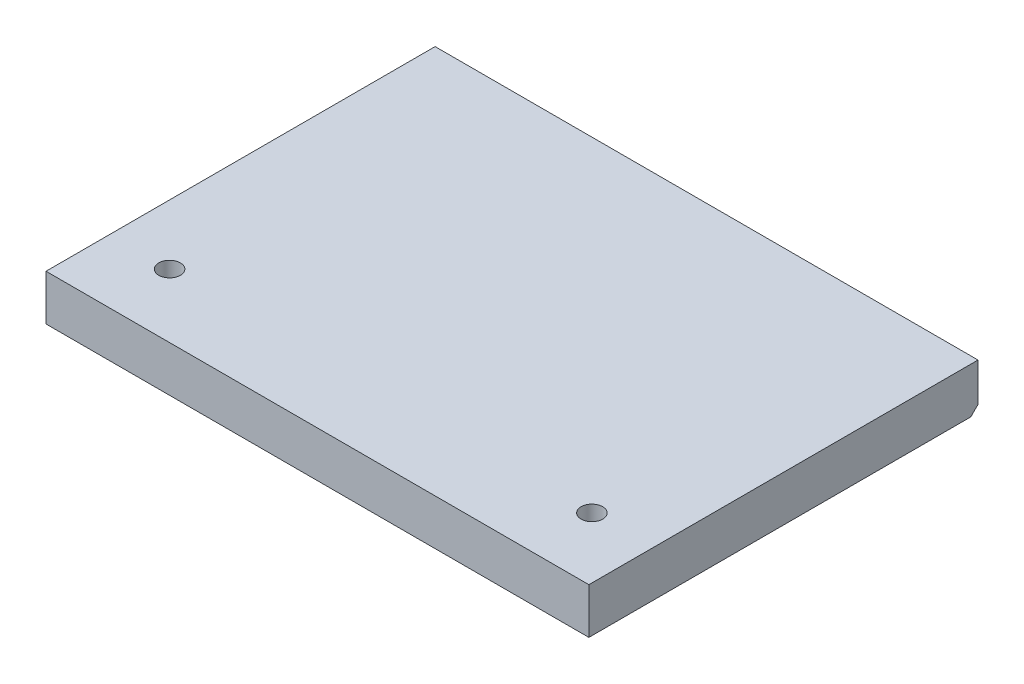
ISO-10303-21;
HEADER;
FILE_DESCRIPTION(('STEP AP214'),'2;1');
FILE_NAME('part.step','',(''),(''),'','','');
FILE_SCHEMA(('AUTOMOTIVE_DESIGN { 1 0 10303 214 1 1 1 1 }'));
ENDSEC;
DATA;
#1=APPLICATION_CONTEXT('core data for automotive mechanical design processes');
#2=APPLICATION_PROTOCOL_DEFINITION('international standard','automotive_design',2000,#1);
#3=PRODUCT_CONTEXT('',#1,'mechanical');
#4=PRODUCT('Part','Part','',(#3));
#5=PRODUCT_RELATED_PRODUCT_CATEGORY('part','',(#4));
#6=PRODUCT_DEFINITION_FORMATION('','',#4);
#7=PRODUCT_DEFINITION_CONTEXT('part definition',#1,'design');
#8=PRODUCT_DEFINITION('design','',#6,#7);
#9=PRODUCT_DEFINITION_SHAPE('','',#8);
#10=(LENGTH_UNIT() NAMED_UNIT(*) SI_UNIT(.MILLI.,.METRE.));
#11=(NAMED_UNIT(*) PLANE_ANGLE_UNIT() SI_UNIT($,.RADIAN.));
#12=(NAMED_UNIT(*) SI_UNIT($,.STERADIAN.) SOLID_ANGLE_UNIT());
#13=UNCERTAINTY_MEASURE_WITH_UNIT(LENGTH_MEASURE(1.E-05),#10,'distance_accuracy_value','');
#14=(GEOMETRIC_REPRESENTATION_CONTEXT(3) GLOBAL_UNCERTAINTY_ASSIGNED_CONTEXT((#13)) GLOBAL_UNIT_ASSIGNED_CONTEXT((#10,
#11,#12)) REPRESENTATION_CONTEXT('',''));
#15=CARTESIAN_POINT('',(0.,0.,0.));
#16=DIRECTION('',(0.,0.,1.));
#17=DIRECTION('',(1.,0.,0.));
#18=AXIS2_PLACEMENT_3D('',#15,#16,#17);
#19=CARTESIAN_POINT('',(0.,6.35,192.4));
#20=DIRECTION('',(0.,1.,0.));
#21=DIRECTION('',(0.,0.,-1.));
#22=AXIS2_PLACEMENT_3D('',#19,#20,#21);
#23=PLANE('',#22);
#24=CARTESIAN_POINT('',(23.46,6.35,141.44));
#25=DIRECTION('',(0.,-1.,0.));
#26=DIRECTION('',(0.,0.,-1.));
#27=AXIS2_PLACEMENT_3D('',#24,#25,#26);
#28=CIRCLE('',#27,1.5);
#29=CARTESIAN_POINT('',(23.46,6.35,139.94));
#30=VERTEX_POINT('',#29);
#31=EDGE_CURVE('E146',#30,#30,#28,.T.);
#32=ORIENTED_EDGE('',*,*,#31,.T.);
#33=EDGE_LOOP('',(#32));
#34=FACE_BOUND('',#33,.T.);
#35=CARTESIAN_POINT('',(-35.24,6.35,141.44));
#36=DIRECTION('',(0.,-1.,0.));
#37=DIRECTION('',(0.,0.,-1.));
#38=AXIS2_PLACEMENT_3D('',#35,#36,#37);
#39=CIRCLE('',#38,1.5);
#40=CARTESIAN_POINT('',(-35.24,6.35,139.94));
#41=VERTEX_POINT('',#40);
#42=EDGE_CURVE('E142',#41,#41,#39,.T.);
#43=ORIENTED_EDGE('',*,*,#42,.T.);
#44=EDGE_LOOP('',(#43));
#45=FACE_BOUND('',#44,.T.);
#46=DIRECTION('',(1.,0.,0.));
#47=VECTOR('',#46,1.);
#48=CARTESIAN_POINT('',(-86.2,6.35,96.2));
#49=LINE('',#48,#47);
#50=CARTESIAN_POINT('',(-43.5724429833944,6.35,96.2));
#51=VERTEX_POINT('',#50);
#52=CARTESIAN_POINT('',(31.8882124627076,6.35,96.2));
#53=VERTEX_POINT('',#52);
#54=EDGE_CURVE('E157',#51,#53,#49,.T.);
#55=ORIENTED_EDGE('',*,*,#54,.F.);
#56=DIRECTION('',(0.,0.,1.));
#57=VECTOR('',#56,1.);
#58=CARTESIAN_POINT('',(-43.5724429833944,6.35,192.4));
#59=LINE('',#58,#57);
#60=CARTESIAN_POINT('',(-43.5724429833944,6.35,150.288085831692));
#61=VERTEX_POINT('',#60);
#62=EDGE_CURVE('E71',#51,#61,#59,.T.);
#63=ORIENTED_EDGE('',*,*,#62,.T.);
#64=DIRECTION('',(1.,0.,0.));
#65=VECTOR('',#64,1.);
#66=CARTESIAN_POINT('',(0.,6.35,150.288085831692));
#67=LINE('',#66,#65);
#68=CARTESIAN_POINT('',(31.8882124627076,6.35,150.288085831692));
#69=VERTEX_POINT('',#68);
#70=EDGE_CURVE('E110',#61,#69,#67,.T.);
#71=ORIENTED_EDGE('',*,*,#70,.T.);
#72=DIRECTION('',(0.,0.,-1.));
#73=VECTOR('',#72,1.);
#74=CARTESIAN_POINT('',(31.8882124627076,6.35,192.4));
#75=LINE('',#74,#73);
#76=EDGE_CURVE('E125',#69,#53,#75,.T.);
#77=ORIENTED_EDGE('',*,*,#76,.T.);
#78=EDGE_LOOP('',(#55,#63,#71,#77));
#79=FACE_BOUND('',#78,.T.);
#80=ADVANCED_FACE('F47',(#34,#45,#79),#23,.T.);
#81=CARTESIAN_POINT('',(-86.2,6.35,96.2));
#82=DIRECTION('',(0.,0.,1.));
#83=DIRECTION('',(-1.,0.,0.));
#84=AXIS2_PLACEMENT_3D('',#81,#82,#83);
#85=PLANE('',#84);
#86=DIRECTION('',(0.,-1.,0.));
#87=VECTOR('',#86,1.);
#88=CARTESIAN_POINT('',(-43.5724429833944,6.35,96.2));
#89=LINE('',#88,#87);
#90=CARTESIAN_POINT('',(-43.5724429833944,1.,96.2));
#91=VERTEX_POINT('',#90);
#92=EDGE_CURVE('E129',#51,#91,#89,.T.);
#93=ORIENTED_EDGE('',*,*,#92,.F.);
#94=ORIENTED_EDGE('',*,*,#54,.T.);
#95=DIRECTION('',(0.,1.,0.));
#96=VECTOR('',#95,1.);
#97=CARTESIAN_POINT('',(31.8882124627076,6.35,96.2));
#98=LINE('',#97,#96);
#99=CARTESIAN_POINT('',(31.8882124627076,1.,96.2));
#100=VERTEX_POINT('',#99);
#101=EDGE_CURVE('E121',#100,#53,#98,.T.);
#102=ORIENTED_EDGE('',*,*,#101,.F.);
#103=DIRECTION('',(1.,0.,0.));
#104=VECTOR('',#103,1.);
#105=CARTESIAN_POINT('',(-86.2,1.,96.2));
#106=LINE('',#105,#104);
#107=EDGE_CURVE('E175',#91,#100,#106,.T.);
#108=ORIENTED_EDGE('',*,*,#107,.F.);
#109=EDGE_LOOP('',(#93,#94,#102,#108));
#110=FACE_BOUND('',#109,.T.);
#111=ADVANCED_FACE('F184',(#110),#85,.F.);
#112=CARTESIAN_POINT('',(0.,0.,192.4));
#113=DIRECTION('',(0.,1.,0.));
#114=DIRECTION('',(0.,0.,-1.));
#115=AXIS2_PLACEMENT_3D('',#112,#113,#114);
#116=PLANE('',#115);
#117=CARTESIAN_POINT('',(-35.24,0.,141.44));
#118=DIRECTION('',(0.,-1.,0.));
#119=DIRECTION('',(0.,0.,-1.));
#120=AXIS2_PLACEMENT_3D('',#117,#118,#119);
#121=CIRCLE('',#120,1.35);
#122=CARTESIAN_POINT('',(-35.24,0.,140.09));
#123=VERTEX_POINT('',#122);
#124=EDGE_CURVE('E158',#123,#123,#121,.F.);
#125=ORIENTED_EDGE('',*,*,#124,.T.);
#126=EDGE_LOOP('',(#125));
#127=FACE_BOUND('',#126,.T.);
#128=CARTESIAN_POINT('',(23.46,0.,141.44));
#129=DIRECTION('',(0.,-1.,0.));
#130=DIRECTION('',(0.,0.,-1.));
#131=AXIS2_PLACEMENT_3D('',#128,#129,#130);
#132=CIRCLE('',#131,1.35);
#133=CARTESIAN_POINT('',(23.46,0.,140.09));
#134=VERTEX_POINT('',#133);
#135=EDGE_CURVE('E153',#134,#134,#132,.F.);
#136=ORIENTED_EDGE('',*,*,#135,.T.);
#137=EDGE_LOOP('',(#136));
#138=FACE_BOUND('',#137,.T.);
#139=DIRECTION('',(0.,0.,1.));
#140=VECTOR('',#139,1.);
#141=CARTESIAN_POINT('',(-43.5724429833944,0.,84.5642891528287));
#142=LINE('',#141,#140);
#143=CARTESIAN_POINT('',(-43.5724429833944,0.,97.2));
#144=VERTEX_POINT('',#143);
#145=CARTESIAN_POINT('',(-43.5724429833944,0.,150.288085831692));
#146=VERTEX_POINT('',#145);
#147=EDGE_CURVE('E94',#144,#146,#142,.T.);
#148=ORIENTED_EDGE('',*,*,#147,.F.);
#149=DIRECTION('',(-1.,0.,0.));
#150=VECTOR('',#149,1.);
#151=CARTESIAN_POINT('',(0.,0.,97.2));
#152=LINE('',#151,#150);
#153=CARTESIAN_POINT('',(31.8882124627076,0.,97.2));
#154=VERTEX_POINT('',#153);
#155=EDGE_CURVE('E166',#154,#144,#152,.T.);
#156=ORIENTED_EDGE('',*,*,#155,.F.);
#157=DIRECTION('',(0.,0.,-1.));
#158=VECTOR('',#157,1.);
#159=CARTESIAN_POINT('',(31.8882124627076,0.,84.5642891528287));
#160=LINE('',#159,#158);
#161=CARTESIAN_POINT('',(31.8882124627076,0.,150.288085831692));
#162=VERTEX_POINT('',#161);
#163=EDGE_CURVE('E63',#162,#154,#160,.T.);
#164=ORIENTED_EDGE('',*,*,#163,.F.);
#165=DIRECTION('',(1.,0.,0.));
#166=VECTOR('',#165,1.);
#167=CARTESIAN_POINT('',(-43.5724429833944,0.,150.288085831692));
#168=LINE('',#167,#166);
#169=EDGE_CURVE('E103',#146,#162,#168,.T.);
#170=ORIENTED_EDGE('',*,*,#169,.F.);
#171=EDGE_LOOP('',(#148,#156,#164,#170));
#172=FACE_BOUND('',#171,.T.);
#173=ADVANCED_FACE('F114',(#127,#138,#172),#116,.F.);
#174=CARTESIAN_POINT('',(-86.2,1.,96.2));
#175=DIRECTION('',(0.,0.707106781186547,0.707106781186547));
#176=DIRECTION('',(1.,0.,0.));
#177=AXIS2_PLACEMENT_3D('',#174,#175,#176);
#178=PLANE('',#177);
#179=ORIENTED_EDGE('',*,*,#155,.T.);
#180=DIRECTION('',(0.,-0.707106781186548,0.707106781186548));
#181=VECTOR('',#180,1.);
#182=CARTESIAN_POINT('',(-43.5724429833944,1.,96.2));
#183=LINE('',#182,#181);
#184=EDGE_CURVE('E11',#144,#91,#183,.F.);
#185=ORIENTED_EDGE('',*,*,#184,.T.);
#186=ORIENTED_EDGE('',*,*,#107,.T.);
#187=DIRECTION('',(0.,0.707106781186548,-0.707106781186548));
#188=VECTOR('',#187,1.);
#189=CARTESIAN_POINT('',(31.8882124627076,1.,96.2));
#190=LINE('',#189,#188);
#191=EDGE_CURVE('E56',#100,#154,#190,.F.);
#192=ORIENTED_EDGE('',*,*,#191,.T.);
#193=EDGE_LOOP('',(#179,#185,#186,#192));
#194=FACE_BOUND('',#193,.T.);
#195=ADVANCED_FACE('F49',(#194),#178,.F.);
#196=CARTESIAN_POINT('',(-35.24,-0.00100000000000013,141.44));
#197=DIRECTION('',(0.,1.,0.));
#198=DIRECTION('',(0.,0.,-1.));
#199=AXIS2_PLACEMENT_3D('',#196,#197,#198);
#200=CYLINDRICAL_SURFACE('',#199,1.35);
#201=ORIENTED_EDGE('',*,*,#124,.F.);
#202=EDGE_LOOP('',(#201));
#203=FACE_BOUND('',#202,.T.);
#204=CARTESIAN_POINT('',(-35.24,1.35,141.44));
#205=DIRECTION('',(0.,-1.,0.));
#206=DIRECTION('',(0.,0.,-1.));
#207=AXIS2_PLACEMENT_3D('',#204,#205,#206);
#208=CIRCLE('',#207,1.35);
#209=CARTESIAN_POINT('',(-35.24,1.35,140.09));
#210=VERTEX_POINT('',#209);
#211=EDGE_CURVE('E162',#210,#210,#208,.F.);
#212=ORIENTED_EDGE('',*,*,#211,.T.);
#213=EDGE_LOOP('',(#212));
#214=FACE_BOUND('',#213,.T.);
#215=ADVANCED_FACE('F197',(#203,#214),#200,.F.);
#216=CARTESIAN_POINT('',(23.46,-0.00100000000000013,141.44));
#217=DIRECTION('',(0.,1.,0.));
#218=DIRECTION('',(0.,0.,-1.));
#219=AXIS2_PLACEMENT_3D('',#216,#217,#218);
#220=CYLINDRICAL_SURFACE('',#219,1.35);
#221=ORIENTED_EDGE('',*,*,#135,.F.);
#222=EDGE_LOOP('',(#221));
#223=FACE_BOUND('',#222,.T.);
#224=CARTESIAN_POINT('',(23.46,1.35,141.44));
#225=DIRECTION('',(0.,-1.,0.));
#226=DIRECTION('',(0.,0.,-1.));
#227=AXIS2_PLACEMENT_3D('',#224,#225,#226);
#228=CIRCLE('',#227,1.35);
#229=CARTESIAN_POINT('',(23.46,1.35,140.09));
#230=VERTEX_POINT('',#229);
#231=EDGE_CURVE('E141',#230,#230,#228,.F.);
#232=ORIENTED_EDGE('',*,*,#231,.T.);
#233=EDGE_LOOP('',(#232));
#234=FACE_BOUND('',#233,.T.);
#235=ADVANCED_FACE('F208',(#223,#234),#220,.F.);
#236=CARTESIAN_POINT('',(23.46,1.35,141.44));
#237=DIRECTION('',(0.,1.,0.));
#238=DIRECTION('',(0.,0.,-1.));
#239=AXIS2_PLACEMENT_3D('',#236,#237,#238);
#240=PLANE('',#239);
#241=CARTESIAN_POINT('',(23.46,1.35,141.44));
#242=DIRECTION('',(0.,-1.,0.));
#243=DIRECTION('',(0.,0.,-1.));
#244=AXIS2_PLACEMENT_3D('',#241,#242,#243);
#245=CIRCLE('',#244,1.5);
#246=CARTESIAN_POINT('',(23.46,1.35,139.94));
#247=VERTEX_POINT('',#246);
#248=EDGE_CURVE('E136',#247,#247,#245,.T.);
#249=ORIENTED_EDGE('',*,*,#248,.F.);
#250=EDGE_LOOP('',(#249));
#251=FACE_BOUND('',#250,.T.);
#252=ORIENTED_EDGE('',*,*,#231,.F.);
#253=EDGE_LOOP('',(#252));
#254=FACE_BOUND('',#253,.T.);
#255=ADVANCED_FACE('F211',(#251,#254),#240,.T.);
#256=CARTESIAN_POINT('',(23.46,1.35,141.44));
#257=DIRECTION('',(0.,1.,0.));
#258=DIRECTION('',(0.,0.,-1.));
#259=AXIS2_PLACEMENT_3D('',#256,#257,#258);
#260=CYLINDRICAL_SURFACE('',#259,1.5);
#261=ORIENTED_EDGE('',*,*,#248,.T.);
#262=EDGE_LOOP('',(#261));
#263=FACE_BOUND('',#262,.T.);
#264=ORIENTED_EDGE('',*,*,#31,.F.);
#265=EDGE_LOOP('',(#264));
#266=FACE_BOUND('',#265,.T.);
#267=ADVANCED_FACE('F215',(#263,#266),#260,.F.);
#268=CARTESIAN_POINT('',(-35.24,1.35,141.44));
#269=DIRECTION('',(0.,1.,0.));
#270=DIRECTION('',(0.,0.,-1.));
#271=AXIS2_PLACEMENT_3D('',#268,#269,#270);
#272=PLANE('',#271);
#273=CARTESIAN_POINT('',(-35.24,1.35,141.44));
#274=DIRECTION('',(0.,-1.,0.));
#275=DIRECTION('',(0.,0.,-1.));
#276=AXIS2_PLACEMENT_3D('',#273,#274,#275);
#277=CIRCLE('',#276,1.5);
#278=CARTESIAN_POINT('',(-35.24,1.35,139.94));
#279=VERTEX_POINT('',#278);
#280=EDGE_CURVE('E137',#279,#279,#277,.T.);
#281=ORIENTED_EDGE('',*,*,#280,.F.);
#282=EDGE_LOOP('',(#281));
#283=FACE_BOUND('',#282,.T.);
#284=ORIENTED_EDGE('',*,*,#211,.F.);
#285=EDGE_LOOP('',(#284));
#286=FACE_BOUND('',#285,.T.);
#287=ADVANCED_FACE('F221',(#283,#286),#272,.T.);
#288=CARTESIAN_POINT('',(-35.24,1.35,141.44));
#289=DIRECTION('',(0.,1.,0.));
#290=DIRECTION('',(0.,0.,-1.));
#291=AXIS2_PLACEMENT_3D('',#288,#289,#290);
#292=CYLINDRICAL_SURFACE('',#291,1.5);
#293=ORIENTED_EDGE('',*,*,#280,.T.);
#294=EDGE_LOOP('',(#293));
#295=FACE_BOUND('',#294,.T.);
#296=ORIENTED_EDGE('',*,*,#42,.F.);
#297=EDGE_LOOP('',(#296));
#298=FACE_BOUND('',#297,.T.);
#299=ADVANCED_FACE('F226',(#295,#298),#292,.F.);
#300=CARTESIAN_POINT('',(-43.5724429833944,0.,84.5642891528287));
#301=DIRECTION('',(-1.,0.,0.));
#302=DIRECTION('',(0.,0.,1.));
#303=AXIS2_PLACEMENT_3D('',#300,#301,#302);
#304=PLANE('',#303);
#305=ORIENTED_EDGE('',*,*,#92,.T.);
#306=ORIENTED_EDGE('',*,*,#184,.F.);
#307=ORIENTED_EDGE('',*,*,#147,.T.);
#308=DIRECTION('',(0.,1.,0.));
#309=VECTOR('',#308,1.);
#310=CARTESIAN_POINT('',(-43.5724429833944,0.,150.288085831692));
#311=LINE('',#310,#309);
#312=EDGE_CURVE('E97',#146,#61,#311,.T.);
#313=ORIENTED_EDGE('',*,*,#312,.T.);
#314=ORIENTED_EDGE('',*,*,#62,.F.);
#315=EDGE_LOOP('',(#305,#306,#307,#313,#314));
#316=FACE_BOUND('',#315,.T.);
#317=ADVANCED_FACE('F96',(#316),#304,.T.);
#318=CARTESIAN_POINT('',(31.8882124627076,0.,84.5642891528287));
#319=DIRECTION('',(1.,0.,0.));
#320=DIRECTION('',(0.,0.,-1.));
#321=AXIS2_PLACEMENT_3D('',#318,#319,#320);
#322=PLANE('',#321);
#323=DIRECTION('',(0.,1.,0.));
#324=VECTOR('',#323,1.);
#325=CARTESIAN_POINT('',(31.8882124627076,0.,150.288085831692));
#326=LINE('',#325,#324);
#327=EDGE_CURVE('E112',#162,#69,#326,.T.);
#328=ORIENTED_EDGE('',*,*,#327,.F.);
#329=ORIENTED_EDGE('',*,*,#163,.T.);
#330=ORIENTED_EDGE('',*,*,#191,.F.);
#331=ORIENTED_EDGE('',*,*,#101,.T.);
#332=ORIENTED_EDGE('',*,*,#76,.F.);
#333=EDGE_LOOP('',(#328,#329,#330,#331,#332));
#334=FACE_BOUND('',#333,.T.);
#335=ADVANCED_FACE('F182',(#334),#322,.T.);
#336=CARTESIAN_POINT('',(-43.5724429833944,0.,150.288085831692));
#337=DIRECTION('',(0.,0.,1.));
#338=DIRECTION('',(1.,0.,0.));
#339=AXIS2_PLACEMENT_3D('',#336,#337,#338);
#340=PLANE('',#339);
#341=ORIENTED_EDGE('',*,*,#312,.F.);
#342=ORIENTED_EDGE('',*,*,#169,.T.);
#343=ORIENTED_EDGE('',*,*,#327,.T.);
#344=ORIENTED_EDGE('',*,*,#70,.F.);
#345=EDGE_LOOP('',(#341,#342,#343,#344));
#346=FACE_BOUND('',#345,.T.);
#347=ADVANCED_FACE('F107',(#346),#340,.T.);
#348=CLOSED_SHELL('',(#80,#111,#173,#195,#215,#235,#255,#267,#287,#299,#317,#335,#347));
#349=MANIFOLD_SOLID_BREP('B2',#348);
#350=ADVANCED_BREP_SHAPE_REPRESENTATION('',(#18,#349),#14);
#351=SHAPE_DEFINITION_REPRESENTATION(#9,#350);
ENDSEC;
END-ISO-10303-21;
